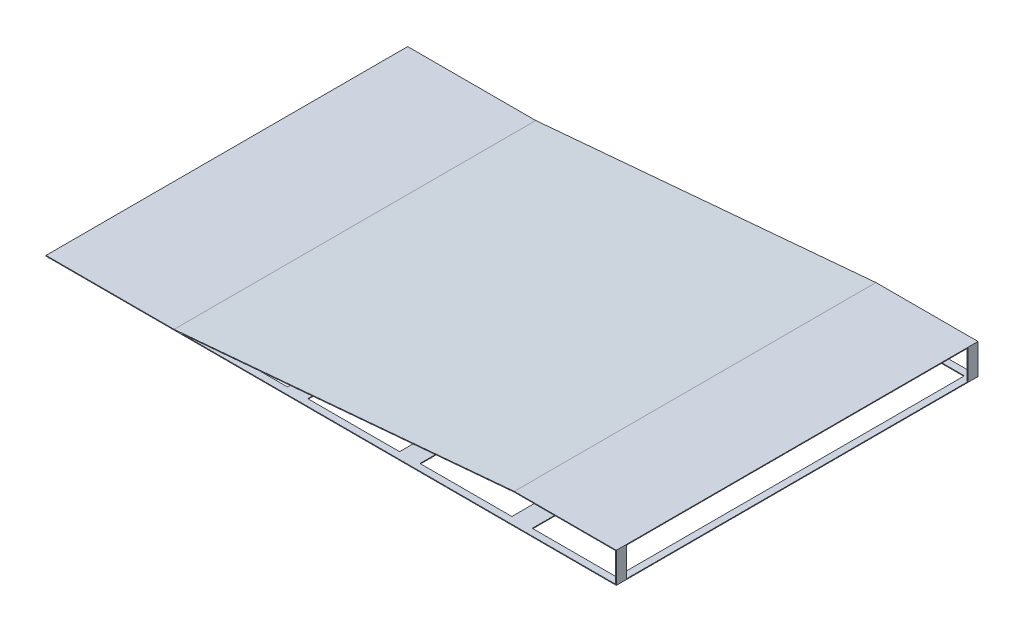
ISO-10303-21;
HEADER;
FILE_DESCRIPTION(('STEP AP214'),'2;1');
FILE_NAME('part.step','',(''),(''),'','','');
FILE_SCHEMA(('AUTOMOTIVE_DESIGN { 1 0 10303 214 1 1 1 1 }'));
ENDSEC;
DATA;
#1=APPLICATION_CONTEXT('core data for automotive mechanical design processes');
#2=APPLICATION_PROTOCOL_DEFINITION('international standard','automotive_design',2000,#1);
#3=PRODUCT_CONTEXT('',#1,'mechanical');
#4=PRODUCT('Part','Part','',(#3));
#5=PRODUCT_RELATED_PRODUCT_CATEGORY('part','',(#4));
#6=PRODUCT_DEFINITION_FORMATION('','',#4);
#7=PRODUCT_DEFINITION_CONTEXT('part definition',#1,'design');
#8=PRODUCT_DEFINITION('design','',#6,#7);
#9=PRODUCT_DEFINITION_SHAPE('','',#8);
#10=(LENGTH_UNIT() NAMED_UNIT(*) SI_UNIT(.MILLI.,.METRE.));
#11=(NAMED_UNIT(*) PLANE_ANGLE_UNIT() SI_UNIT($,.RADIAN.));
#12=(NAMED_UNIT(*) SI_UNIT($,.STERADIAN.) SOLID_ANGLE_UNIT());
#13=UNCERTAINTY_MEASURE_WITH_UNIT(LENGTH_MEASURE(1.E-05),#10,'distance_accuracy_value','');
#14=(GEOMETRIC_REPRESENTATION_CONTEXT(3) GLOBAL_UNCERTAINTY_ASSIGNED_CONTEXT((#13)) GLOBAL_UNIT_ASSIGNED_CONTEXT((#10,
#11,#12)) REPRESENTATION_CONTEXT('',''));
#15=CARTESIAN_POINT('',(0.,0.,0.));
#16=DIRECTION('',(0.,0.,1.));
#17=DIRECTION('',(1.,0.,0.));
#18=AXIS2_PLACEMENT_3D('',#15,#16,#17);
#19=CARTESIAN_POINT('',(8372.5,9.99999999999999,0.));
#20=DIRECTION('',(1.,0.,0.));
#21=DIRECTION('',(0.,0.,-1.));
#22=AXIS2_PLACEMENT_3D('',#19,#20,#21);
#23=PLANE('',#22);
#24=DIRECTION('',(0.,1.,0.));
#25=VECTOR('',#24,1.);
#26=CARTESIAN_POINT('',(8372.5,9.99999999999999,5166.));
#27=LINE('',#26,#25);
#28=CARTESIAN_POINT('',(8372.5,9.99999999999999,5166.));
#29=VERTEX_POINT('',#28);
#30=CARTESIAN_POINT('',(8372.5,437.443317629587,5166.));
#31=VERTEX_POINT('',#30);
#32=EDGE_CURVE('E11',#29,#31,#27,.T.);
#33=ORIENTED_EDGE('',*,*,#32,.F.);
#34=DIRECTION('',(0.,0.,1.));
#35=VECTOR('',#34,1.);
#36=CARTESIAN_POINT('',(8372.5,9.99999999999999,0.));
#37=LINE('',#36,#35);
#38=CARTESIAN_POINT('',(8372.5,9.99999999999999,5316.));
#39=VERTEX_POINT('',#38);
#40=EDGE_CURVE('E399',#29,#39,#37,.T.);
#41=ORIENTED_EDGE('',*,*,#40,.T.);
#42=DIRECTION('',(0.,1.,0.));
#43=VECTOR('',#42,1.);
#44=CARTESIAN_POINT('',(8372.5,9.99999999999999,5316.));
#45=LINE('',#44,#43);
#46=CARTESIAN_POINT('',(8372.5,437.443317629587,5316.));
#47=VERTEX_POINT('',#46);
#48=EDGE_CURVE('E402',#39,#47,#45,.T.);
#49=ORIENTED_EDGE('',*,*,#48,.T.);
#50=DIRECTION('',(0.,0.,1.));
#51=VECTOR('',#50,1.);
#52=CARTESIAN_POINT('',(8372.5,437.443317629587,0.));
#53=LINE('',#52,#51);
#54=EDGE_CURVE('E416',#31,#47,#53,.T.);
#55=ORIENTED_EDGE('',*,*,#54,.F.);
#56=EDGE_LOOP('',(#33,#41,#49,#55));
#57=FACE_BOUND('',#56,.T.);
#58=ADVANCED_FACE('F35',(#57),#23,.F.);
#59=CARTESIAN_POINT('',(8382.5,0.,5316.));
#60=DIRECTION('',(0.,1.,0.));
#61=DIRECTION('',(-1.,0.,0.));
#62=AXIS2_PLACEMENT_3D('',#59,#60,#61);
#63=PLANE('',#62);
#64=DIRECTION('',(0.,0.,-1.));
#65=VECTOR('',#64,1.);
#66=CARTESIAN_POINT('',(3747.23713245686,0.,3.25275132383421E-13));
#67=LINE('',#66,#65);
#68=CARTESIAN_POINT('',(3747.23713245686,0.,5216.));
#69=VERTEX_POINT('',#68);
#70=CARTESIAN_POINT('',(3747.23713245686,0.,99.9999999999999));
#71=VERTEX_POINT('',#70);
#72=EDGE_CURVE('E275',#69,#71,#67,.T.);
#73=ORIENTED_EDGE('',*,*,#72,.F.);
#74=DIRECTION('',(-1.,0.,0.));
#75=VECTOR('',#74,1.);
#76=CARTESIAN_POINT('',(0.,0.,5216.));
#77=LINE('',#76,#75);
#78=CARTESIAN_POINT('',(5097.23713245686,0.,5216.));
#79=VERTEX_POINT('',#78);
#80=EDGE_CURVE('E273',#79,#69,#77,.T.);
#81=ORIENTED_EDGE('',*,*,#80,.F.);
#82=DIRECTION('',(0.,0.,-1.));
#83=VECTOR('',#82,1.);
#84=CARTESIAN_POINT('',(5097.23713245686,0.,8.84921036188884E-13));
#85=LINE('',#84,#83);
#86=CARTESIAN_POINT('',(5097.23713245686,0.,99.9999999999996));
#87=VERTEX_POINT('',#86);
#88=EDGE_CURVE('E264',#79,#87,#85,.T.);
#89=ORIENTED_EDGE('',*,*,#88,.T.);
#90=DIRECTION('',(1.,0.,0.));
#91=VECTOR('',#90,1.);
#92=CARTESIAN_POINT('',(0.,0.,100.));
#93=LINE('',#92,#91);
#94=EDGE_CURVE('E279',#71,#87,#93,.T.);
#95=ORIENTED_EDGE('',*,*,#94,.F.);
#96=EDGE_LOOP('',(#73,#81,#89,#95));
#97=FACE_BOUND('',#96,.T.);
#98=DIRECTION('',(-1.,0.,0.));
#99=VECTOR('',#98,1.);
#100=CARTESIAN_POINT('',(0.,0.,5216.));
#101=LINE('',#100,#99);
#102=CARTESIAN_POINT('',(8282.5,0.,5216.));
#103=VERTEX_POINT('',#102);
#104=CARTESIAN_POINT('',(7047.23713245686,0.,5216.));
#105=VERTEX_POINT('',#104);
#106=EDGE_CURVE('E308',#103,#105,#101,.T.);
#107=ORIENTED_EDGE('',*,*,#106,.F.);
#108=DIRECTION('',(0.,0.,1.));
#109=VECTOR('',#108,1.);
#110=CARTESIAN_POINT('',(8282.5,0.,0.));
#111=LINE('',#110,#109);
#112=CARTESIAN_POINT('',(8282.5,0.,99.9999999999998));
#113=VERTEX_POINT('',#112);
#114=EDGE_CURVE('E306',#113,#103,#111,.T.);
#115=ORIENTED_EDGE('',*,*,#114,.F.);
#116=DIRECTION('',(1.,0.,0.));
#117=VECTOR('',#116,1.);
#118=CARTESIAN_POINT('',(0.,0.,100.));
#119=LINE('',#118,#117);
#120=CARTESIAN_POINT('',(7047.23713245686,0.,99.9999999999996));
#121=VERTEX_POINT('',#120);
#122=EDGE_CURVE('E296',#121,#113,#119,.T.);
#123=ORIENTED_EDGE('',*,*,#122,.F.);
#124=DIRECTION('',(0.,0.,-1.));
#125=VECTOR('',#124,1.);
#126=CARTESIAN_POINT('',(7047.23713245686,0.,0.));
#127=LINE('',#126,#125);
#128=EDGE_CURVE('E312',#105,#121,#127,.T.);
#129=ORIENTED_EDGE('',*,*,#128,.F.);
#130=EDGE_LOOP('',(#107,#115,#123,#129));
#131=FACE_BOUND('',#130,.T.);
#132=DIRECTION('',(0.,0.,-1.));
#133=VECTOR('',#132,1.);
#134=CARTESIAN_POINT('',(3447.23713245686,0.,5.98467871117499E-13));
#135=LINE('',#134,#133);
#136=CARTESIAN_POINT('',(3447.23713245686,0.,5216.));
#137=VERTEX_POINT('',#136);
#138=CARTESIAN_POINT('',(3447.23713245686,0.,99.9999999999999));
#139=VERTEX_POINT('',#138);
#140=EDGE_CURVE('E286',#137,#139,#135,.T.);
#141=ORIENTED_EDGE('',*,*,#140,.T.);
#142=DIRECTION('',(1.,0.,0.));
#143=VECTOR('',#142,1.);
#144=CARTESIAN_POINT('',(0.,0.,100.));
#145=LINE('',#144,#143);
#146=CARTESIAN_POINT('',(2097.23713245686,0.,99.9999999999997));
#147=VERTEX_POINT('',#146);
#148=EDGE_CURVE('E357',#147,#139,#145,.T.);
#149=ORIENTED_EDGE('',*,*,#148,.F.);
#150=DIRECTION('',(0.,0.,-1.));
#151=VECTOR('',#150,1.);
#152=CARTESIAN_POINT('',(2097.23713245686,0.,3.64097099695457E-13));
#153=LINE('',#152,#151);
#154=CARTESIAN_POINT('',(2097.23713245686,0.,5216.));
#155=VERTEX_POINT('',#154);
#156=EDGE_CURVE('E372',#155,#147,#153,.T.);
#157=ORIENTED_EDGE('',*,*,#156,.F.);
#158=DIRECTION('',(-1.,0.,0.));
#159=VECTOR('',#158,1.);
#160=CARTESIAN_POINT('',(0.,0.,5216.));
#161=LINE('',#160,#159);
#162=EDGE_CURVE('E369',#137,#155,#161,.T.);
#163=ORIENTED_EDGE('',*,*,#162,.F.);
#164=EDGE_LOOP('',(#141,#149,#157,#163));
#165=FACE_BOUND('',#164,.T.);
#166=DIRECTION('',(1.,0.,0.));
#167=VECTOR('',#166,1.);
#168=CARTESIAN_POINT('',(8382.5,0.,0.));
#169=LINE('',#168,#167);
#170=CARTESIAN_POINT('',(0.,0.,0.));
#171=VERTEX_POINT('',#170);
#172=CARTESIAN_POINT('',(8382.5,0.,0.));
#173=VERTEX_POINT('',#172);
#174=EDGE_CURVE('E437',#171,#173,#169,.T.);
#175=ORIENTED_EDGE('',*,*,#174,.T.);
#176=DIRECTION('',(0.,0.,-1.));
#177=VECTOR('',#176,1.);
#178=CARTESIAN_POINT('',(8382.5,0.,5316.));
#179=LINE('',#178,#177);
#180=CARTESIAN_POINT('',(8382.5,0.,5316.));
#181=VERTEX_POINT('',#180);
#182=EDGE_CURVE('E457',#181,#173,#179,.T.);
#183=ORIENTED_EDGE('',*,*,#182,.F.);
#184=DIRECTION('',(1.,0.,0.));
#185=VECTOR('',#184,1.);
#186=CARTESIAN_POINT('',(8382.5,0.,5316.));
#187=LINE('',#186,#185);
#188=CARTESIAN_POINT('',(0.,0.,5316.));
#189=VERTEX_POINT('',#188);
#190=EDGE_CURVE('E423',#189,#181,#187,.T.);
#191=ORIENTED_EDGE('',*,*,#190,.F.);
#192=DIRECTION('',(0.,0.,-1.));
#193=VECTOR('',#192,1.);
#194=CARTESIAN_POINT('',(0.,0.,5316.));
#195=LINE('',#194,#193);
#196=EDGE_CURVE('E460',#189,#171,#195,.T.);
#197=ORIENTED_EDGE('',*,*,#196,.T.);
#198=EDGE_LOOP('',(#175,#183,#191,#197));
#199=FACE_BOUND('',#198,.T.);
#200=DIRECTION('',(0.,0.,-1.));
#201=VECTOR('',#200,1.);
#202=CARTESIAN_POINT('',(6747.23713245686,0.,1.17137420126027E-12));
#203=LINE('',#202,#201);
#204=CARTESIAN_POINT('',(6747.23713245686,0.,5216.));
#205=VERTEX_POINT('',#204);
#206=CARTESIAN_POINT('',(6747.23713245686,0.,99.9999999999996));
#207=VERTEX_POINT('',#206);
#208=EDGE_CURVE('E257',#205,#207,#203,.T.);
#209=ORIENTED_EDGE('',*,*,#208,.T.);
#210=DIRECTION('',(1.,0.,0.));
#211=VECTOR('',#210,1.);
#212=CARTESIAN_POINT('',(0.,0.,100.));
#213=LINE('',#212,#211);
#214=CARTESIAN_POINT('',(5397.23713245686,0.,99.9999999999996));
#215=VERTEX_POINT('',#214);
#216=EDGE_CURVE('E327',#215,#207,#213,.T.);
#217=ORIENTED_EDGE('',*,*,#216,.F.);
#218=DIRECTION('',(0.,0.,-1.));
#219=VECTOR('',#218,1.);
#220=CARTESIAN_POINT('',(5397.23713245686,0.,9.37003429838227E-13));
#221=LINE('',#220,#219);
#222=CARTESIAN_POINT('',(5397.23713245686,0.,5216.));
#223=VERTEX_POINT('',#222);
#224=EDGE_CURVE('E342',#223,#215,#221,.T.);
#225=ORIENTED_EDGE('',*,*,#224,.F.);
#226=DIRECTION('',(-1.,0.,0.));
#227=VECTOR('',#226,1.);
#228=CARTESIAN_POINT('',(0.,0.,5216.));
#229=LINE('',#228,#227);
#230=EDGE_CURVE('E339',#205,#223,#229,.T.);
#231=ORIENTED_EDGE('',*,*,#230,.F.);
#232=EDGE_LOOP('',(#209,#217,#225,#231));
#233=FACE_BOUND('',#232,.T.);
#234=ADVANCED_FACE('F499',(#97,#131,#165,#199,#233),#63,.F.);
#235=CARTESIAN_POINT('',(1997.23713245686,10.0000000000067,0.));
#236=DIRECTION('',(0.,-1.,0.));
#237=DIRECTION('',(1.,0.,0.));
#238=AXIS2_PLACEMENT_3D('',#235,#236,#237);
#239=PLANE('',#238);
#240=ORIENTED_EDGE('',*,*,#40,.F.);
#241=DIRECTION('',(1.,0.,0.));
#242=VECTOR('',#241,1.);
#243=CARTESIAN_POINT('',(8282.5,9.99999999999999,5166.));
#244=LINE('',#243,#242);
#245=CARTESIAN_POINT('',(8382.5,9.99999999999999,5166.));
#246=VERTEX_POINT('',#245);
#247=EDGE_CURVE('E255',#29,#246,#244,.T.);
#248=ORIENTED_EDGE('',*,*,#247,.T.);
#249=DIRECTION('',(0.,0.,-1.));
#250=VECTOR('',#249,1.);
#251=CARTESIAN_POINT('',(8382.5,9.99999999999999,0.));
#252=LINE('',#251,#250);
#253=CARTESIAN_POINT('',(8382.5,9.99999999999999,150.));
#254=VERTEX_POINT('',#253);
#255=EDGE_CURVE('E50',#246,#254,#252,.T.);
#256=ORIENTED_EDGE('',*,*,#255,.T.);
#257=DIRECTION('',(1.,0.,0.));
#258=VECTOR('',#257,1.);
#259=CARTESIAN_POINT('',(8282.5,9.99999999999999,150.));
#260=LINE('',#259,#258);
#261=CARTESIAN_POINT('',(8372.5,9.99999999999999,150.));
#262=VERTEX_POINT('',#261);
#263=EDGE_CURVE('E240',#262,#254,#260,.T.);
#264=ORIENTED_EDGE('',*,*,#263,.F.);
#265=CARTESIAN_POINT('',(8372.5,9.99999999999999,0.));
#266=VERTEX_POINT('',#265);
#267=EDGE_CURVE('E417',#266,#262,#37,.T.);
#268=ORIENTED_EDGE('',*,*,#267,.F.);
#269=DIRECTION('',(1.,0.,0.));
#270=VECTOR('',#269,1.);
#271=CARTESIAN_POINT('',(1997.23713245686,10.0000000000067,0.));
#272=LINE('',#271,#270);
#273=CARTESIAN_POINT('',(1997.23713245686,10.0000000000067,0.));
#274=VERTEX_POINT('',#273);
#275=EDGE_CURVE('E386',#274,#266,#272,.T.);
#276=ORIENTED_EDGE('',*,*,#275,.F.);
#277=DIRECTION('',(0.,0.,1.));
#278=VECTOR('',#277,1.);
#279=CARTESIAN_POINT('',(1997.23713245686,10.0000000000067,0.));
#280=LINE('',#279,#278);
#281=CARTESIAN_POINT('',(1997.23713245686,10.0000000000067,5316.));
#282=VERTEX_POINT('',#281);
#283=EDGE_CURVE('E410',#274,#282,#280,.T.);
#284=ORIENTED_EDGE('',*,*,#283,.T.);
#285=DIRECTION('',(1.,0.,0.));
#286=VECTOR('',#285,1.);
#287=CARTESIAN_POINT('',(1997.23713245686,10.0000000000067,5316.));
#288=LINE('',#287,#286);
#289=EDGE_CURVE('E379',#282,#39,#288,.T.);
#290=ORIENTED_EDGE('',*,*,#289,.T.);
#291=EDGE_LOOP('',(#240,#248,#256,#264,#268,#276,#284,#290));
#292=FACE_BOUND('',#291,.T.);
#293=DIRECTION('',(0.,0.,1.));
#294=VECTOR('',#293,1.);
#295=CARTESIAN_POINT('',(8282.5,9.99999999999999,0.));
#296=LINE('',#295,#294);
#297=CARTESIAN_POINT('',(8282.5,9.99999999999999,99.9999999999998));
#298=VERTEX_POINT('',#297);
#299=CARTESIAN_POINT('',(8282.5,9.99999999999999,5216.));
#300=VERTEX_POINT('',#299);
#301=EDGE_CURVE('E293',#298,#300,#296,.T.);
#302=ORIENTED_EDGE('',*,*,#301,.T.);
#303=DIRECTION('',(-1.,0.,0.));
#304=VECTOR('',#303,1.);
#305=CARTESIAN_POINT('',(0.,10.,5216.));
#306=LINE('',#305,#304);
#307=CARTESIAN_POINT('',(7047.23713245686,10.0000000000014,5216.));
#308=VERTEX_POINT('',#307);
#309=EDGE_CURVE('E295',#300,#308,#306,.T.);
#310=ORIENTED_EDGE('',*,*,#309,.T.);
#311=DIRECTION('',(0.,0.,-1.));
#312=VECTOR('',#311,1.);
#313=CARTESIAN_POINT('',(7047.23713245686,9.99999999999999,0.));
#314=LINE('',#313,#312);
#315=CARTESIAN_POINT('',(7047.23713245686,9.99999999999999,99.9999999999996));
#316=VERTEX_POINT('',#315);
#317=EDGE_CURVE('E299',#308,#316,#314,.T.);
#318=ORIENTED_EDGE('',*,*,#317,.T.);
#319=DIRECTION('',(1.,0.,0.));
#320=VECTOR('',#319,1.);
#321=CARTESIAN_POINT('',(0.,10.,100.));
#322=LINE('',#321,#320);
#323=EDGE_CURVE('E302',#316,#298,#322,.T.);
#324=ORIENTED_EDGE('',*,*,#323,.T.);
#325=EDGE_LOOP('',(#302,#310,#318,#324));
#326=FACE_BOUND('',#325,.T.);
#327=DIRECTION('',(0.,0.,-1.));
#328=VECTOR('',#327,1.);
#329=CARTESIAN_POINT('',(6747.23713245686,9.99999999999999,1.17137420126027E-12));
#330=LINE('',#329,#328);
#331=CARTESIAN_POINT('',(6747.23713245686,9.99999999999999,5216.));
#332=VERTEX_POINT('',#331);
#333=CARTESIAN_POINT('',(6747.23713245686,9.99999999999999,99.9999999999996));
#334=VERTEX_POINT('',#333);
#335=EDGE_CURVE('E324',#332,#334,#330,.T.);
#336=ORIENTED_EDGE('',*,*,#335,.F.);
#337=DIRECTION('',(-1.,0.,0.));
#338=VECTOR('',#337,1.);
#339=CARTESIAN_POINT('',(0.,10.,5216.));
#340=LINE('',#339,#338);
#341=CARTESIAN_POINT('',(5397.23713245686,10.0000000000031,5216.));
#342=VERTEX_POINT('',#341);
#343=EDGE_CURVE('E326',#332,#342,#340,.T.);
#344=ORIENTED_EDGE('',*,*,#343,.T.);
#345=DIRECTION('',(0.,0.,-1.));
#346=VECTOR('',#345,1.);
#347=CARTESIAN_POINT('',(5397.23713245686,9.99999999999999,9.37003429838227E-13));
#348=LINE('',#347,#346);
#349=CARTESIAN_POINT('',(5397.23713245686,9.99999999999999,99.9999999999996));
#350=VERTEX_POINT('',#349);
#351=EDGE_CURVE('E330',#342,#350,#348,.T.);
#352=ORIENTED_EDGE('',*,*,#351,.T.);
#353=DIRECTION('',(1.,0.,0.));
#354=VECTOR('',#353,1.);
#355=CARTESIAN_POINT('',(0.,10.,100.));
#356=LINE('',#355,#354);
#357=EDGE_CURVE('E333',#350,#334,#356,.T.);
#358=ORIENTED_EDGE('',*,*,#357,.T.);
#359=EDGE_LOOP('',(#336,#344,#352,#358));
#360=FACE_BOUND('',#359,.T.);
#361=DIRECTION('',(0.,0.,-1.));
#362=VECTOR('',#361,1.);
#363=CARTESIAN_POINT('',(3447.23713245686,9.99999999999999,5.98467871117499E-13));
#364=LINE('',#363,#362);
#365=CARTESIAN_POINT('',(3447.23713245686,9.99999999999999,5216.));
#366=VERTEX_POINT('',#365);
#367=CARTESIAN_POINT('',(3447.23713245686,9.99999999999999,99.9999999999999));
#368=VERTEX_POINT('',#367);
#369=EDGE_CURVE('E354',#366,#368,#364,.T.);
#370=ORIENTED_EDGE('',*,*,#369,.F.);
#371=DIRECTION('',(-1.,0.,0.));
#372=VECTOR('',#371,1.);
#373=CARTESIAN_POINT('',(0.,10.,5216.));
#374=LINE('',#373,#372);
#375=CARTESIAN_POINT('',(2097.23713245686,10.0000000000066,5216.));
#376=VERTEX_POINT('',#375);
#377=EDGE_CURVE('E356',#366,#376,#374,.T.);
#378=ORIENTED_EDGE('',*,*,#377,.T.);
#379=DIRECTION('',(0.,0.,-1.));
#380=VECTOR('',#379,1.);
#381=CARTESIAN_POINT('',(2097.23713245686,10.,3.64097099695457E-13));
#382=LINE('',#381,#380);
#383=CARTESIAN_POINT('',(2097.23713245686,10.,99.9999999999997));
#384=VERTEX_POINT('',#383);
#385=EDGE_CURVE('E360',#376,#384,#382,.T.);
#386=ORIENTED_EDGE('',*,*,#385,.T.);
#387=DIRECTION('',(1.,0.,0.));
#388=VECTOR('',#387,1.);
#389=CARTESIAN_POINT('',(0.,10.,100.));
#390=LINE('',#389,#388);
#391=EDGE_CURVE('E363',#384,#368,#390,.T.);
#392=ORIENTED_EDGE('',*,*,#391,.T.);
#393=EDGE_LOOP('',(#370,#378,#386,#392));
#394=FACE_BOUND('',#393,.T.);
#395=DIRECTION('',(0.,0.,-1.));
#396=VECTOR('',#395,1.);
#397=CARTESIAN_POINT('',(5097.23713245686,9.99999999999999,8.84921036188884E-13));
#398=LINE('',#397,#396);
#399=CARTESIAN_POINT('',(5097.23713245686,9.99999999999999,5216.));
#400=VERTEX_POINT('',#399);
#401=CARTESIAN_POINT('',(5097.23713245686,9.99999999999999,99.9999999999996));
#402=VERTEX_POINT('',#401);
#403=EDGE_CURVE('E270',#400,#402,#398,.T.);
#404=ORIENTED_EDGE('',*,*,#403,.F.);
#405=DIRECTION('',(-1.,0.,0.));
#406=VECTOR('',#405,1.);
#407=CARTESIAN_POINT('',(0.,10.,5216.));
#408=LINE('',#407,#406);
#409=CARTESIAN_POINT('',(3747.23713245686,9.99999999999999,5216.));
#410=VERTEX_POINT('',#409);
#411=EDGE_CURVE('E260',#400,#410,#408,.T.);
#412=ORIENTED_EDGE('',*,*,#411,.T.);
#413=DIRECTION('',(0.,0.,-1.));
#414=VECTOR('',#413,1.);
#415=CARTESIAN_POINT('',(3747.23713245686,9.99999999999999,3.25275132383421E-13));
#416=LINE('',#415,#414);
#417=CARTESIAN_POINT('',(3747.23713245686,10.0000000000049,99.9999999999999));
#418=VERTEX_POINT('',#417);
#419=EDGE_CURVE('E263',#410,#418,#416,.T.);
#420=ORIENTED_EDGE('',*,*,#419,.T.);
#421=DIRECTION('',(1.,0.,0.));
#422=VECTOR('',#421,1.);
#423=CARTESIAN_POINT('',(0.,10.,100.));
#424=LINE('',#423,#422);
#425=EDGE_CURVE('E267',#418,#402,#424,.T.);
#426=ORIENTED_EDGE('',*,*,#425,.T.);
#427=EDGE_LOOP('',(#404,#412,#420,#426));
#428=FACE_BOUND('',#427,.T.);
#429=ADVANCED_FACE('F466',(#292,#326,#360,#394,#428),#239,.F.);
#430=CARTESIAN_POINT('',(0.,10.,5316.));
#431=DIRECTION('',(1.,0.,0.));
#432=DIRECTION('',(0.,1.,0.));
#433=AXIS2_PLACEMENT_3D('',#430,#431,#432);
#434=PLANE('',#433);
#435=DIRECTION('',(0.,-1.,0.));
#436=VECTOR('',#435,1.);
#437=CARTESIAN_POINT('',(0.,10.,0.));
#438=LINE('',#437,#436);
#439=CARTESIAN_POINT('',(0.,10.,0.));
#440=VERTEX_POINT('',#439);
#441=EDGE_CURVE('E412',#440,#171,#438,.T.);
#442=ORIENTED_EDGE('',*,*,#441,.T.);
#443=ORIENTED_EDGE('',*,*,#196,.F.);
#444=DIRECTION('',(0.,-1.,0.));
#445=VECTOR('',#444,1.);
#446=CARTESIAN_POINT('',(0.,10.,5316.));
#447=LINE('',#446,#445);
#448=CARTESIAN_POINT('',(0.,10.,5316.));
#449=VERTEX_POINT('',#448);
#450=EDGE_CURVE('E420',#449,#189,#447,.T.);
#451=ORIENTED_EDGE('',*,*,#450,.F.);
#452=DIRECTION('',(0.,0.,-1.));
#453=VECTOR('',#452,1.);
#454=CARTESIAN_POINT('',(0.,10.,5316.));
#455=LINE('',#454,#453);
#456=EDGE_CURVE('E434',#449,#440,#455,.T.);
#457=ORIENTED_EDGE('',*,*,#456,.T.);
#458=EDGE_LOOP('',(#442,#443,#451,#457));
#459=FACE_BOUND('',#458,.T.);
#460=ADVANCED_FACE('F37',(#459),#434,.F.);
#461=CARTESIAN_POINT('',(8382.5,0.,5316.));
#462=DIRECTION('',(-1.,0.,0.));
#463=DIRECTION('',(0.,0.,1.));
#464=AXIS2_PLACEMENT_3D('',#461,#462,#463);
#465=PLANE('',#464);
#466=DIRECTION('',(0.,1.,0.));
#467=VECTOR('',#466,1.);
#468=CARTESIAN_POINT('',(8382.5,0.,150.));
#469=LINE('',#468,#467);
#470=CARTESIAN_POINT('',(8382.5,437.443317629587,150.));
#471=VERTEX_POINT('',#470);
#472=EDGE_CURVE('E243',#254,#471,#469,.T.);
#473=ORIENTED_EDGE('',*,*,#472,.F.);
#474=ORIENTED_EDGE('',*,*,#255,.F.);
#475=DIRECTION('',(0.,1.,0.));
#476=VECTOR('',#475,1.);
#477=CARTESIAN_POINT('',(8382.5,0.,5166.));
#478=LINE('',#477,#476);
#479=CARTESIAN_POINT('',(8382.5,437.443317629587,5166.));
#480=VERTEX_POINT('',#479);
#481=EDGE_CURVE('E250',#246,#480,#478,.T.);
#482=ORIENTED_EDGE('',*,*,#481,.T.);
#483=DIRECTION('',(0.,0.,-1.));
#484=VECTOR('',#483,1.);
#485=CARTESIAN_POINT('',(8382.5,437.443317629587,0.));
#486=LINE('',#485,#484);
#487=EDGE_CURVE('E235',#480,#471,#486,.T.);
#488=ORIENTED_EDGE('',*,*,#487,.T.);
#489=EDGE_LOOP('',(#473,#474,#482,#488));
#490=FACE_BOUND('',#489,.T.);
#491=DIRECTION('',(0.,1.,0.));
#492=VECTOR('',#491,1.);
#493=CARTESIAN_POINT('',(8382.5,0.,0.));
#494=LINE('',#493,#492);
#495=CARTESIAN_POINT('',(8382.5,447.443317629587,0.));
#496=VERTEX_POINT('',#495);
#497=EDGE_CURVE('E439',#173,#496,#494,.T.);
#498=ORIENTED_EDGE('',*,*,#497,.T.);
#499=DIRECTION('',(0.,0.,-1.));
#500=VECTOR('',#499,1.);
#501=CARTESIAN_POINT('',(8382.5,447.443317629587,5316.));
#502=LINE('',#501,#500);
#503=CARTESIAN_POINT('',(8382.5,447.443317629587,5316.));
#504=VERTEX_POINT('',#503);
#505=EDGE_CURVE('E454',#504,#496,#502,.T.);
#506=ORIENTED_EDGE('',*,*,#505,.F.);
#507=DIRECTION('',(0.,1.,0.));
#508=VECTOR('',#507,1.);
#509=CARTESIAN_POINT('',(8382.5,0.,5316.));
#510=LINE('',#509,#508);
#511=EDGE_CURVE('E426',#181,#504,#510,.T.);
#512=ORIENTED_EDGE('',*,*,#511,.F.);
#513=ORIENTED_EDGE('',*,*,#182,.T.);
#514=EDGE_LOOP('',(#498,#506,#512,#513));
#515=FACE_BOUND('',#514,.T.);
#516=ADVANCED_FACE('F247',(#490,#515),#465,.F.);
#517=CARTESIAN_POINT('',(8382.5,447.443317629587,5316.));
#518=DIRECTION('',(0.,-1.,0.));
#519=DIRECTION('',(1.,0.,0.));
#520=AXIS2_PLACEMENT_3D('',#517,#518,#519);
#521=PLANE('',#520);
#522=DIRECTION('',(-1.,0.,0.));
#523=VECTOR('',#522,1.);
#524=CARTESIAN_POINT('',(8382.5,447.443317629587,0.));
#525=LINE('',#524,#523);
#526=CARTESIAN_POINT('',(6882.5,447.443317629587,0.));
#527=VERTEX_POINT('',#526);
#528=EDGE_CURVE('E441',#496,#527,#525,.T.);
#529=ORIENTED_EDGE('',*,*,#528,.T.);
#530=DIRECTION('',(0.,0.,-1.));
#531=VECTOR('',#530,1.);
#532=CARTESIAN_POINT('',(6882.5,447.443317629587,5316.));
#533=LINE('',#532,#531);
#534=CARTESIAN_POINT('',(6882.5,447.443317629587,5316.));
#535=VERTEX_POINT('',#534);
#536=EDGE_CURVE('E451',#535,#527,#533,.T.);
#537=ORIENTED_EDGE('',*,*,#536,.F.);
#538=DIRECTION('',(-1.,0.,0.));
#539=VECTOR('',#538,1.);
#540=CARTESIAN_POINT('',(8382.5,447.443317629587,5316.));
#541=LINE('',#540,#539);
#542=EDGE_CURVE('E428',#504,#535,#541,.T.);
#543=ORIENTED_EDGE('',*,*,#542,.F.);
#544=ORIENTED_EDGE('',*,*,#505,.T.);
#545=EDGE_LOOP('',(#529,#537,#543,#544));
#546=FACE_BOUND('',#545,.T.);
#547=ADVANCED_FACE('F604',(#546),#521,.F.);
#548=CARTESIAN_POINT('',(6882.5,447.443317629587,5316.));
#549=DIRECTION('',(0.0871557427476516,-0.996194698091746,0.));
#550=DIRECTION('',(0.996194698091746,0.0871557427476516,0.));
#551=AXIS2_PLACEMENT_3D('',#548,#549,#550);
#552=PLANE('',#551);
#553=DIRECTION('',(-0.996194698091746,-0.0871557427476515,0.));
#554=VECTOR('',#553,1.);
#555=CARTESIAN_POINT('',(6882.5,447.443317629587,0.));
#556=LINE('',#555,#554);
#557=CARTESIAN_POINT('',(1882.5,10.0000000000002,0.));
#558=VERTEX_POINT('',#557);
#559=EDGE_CURVE('E443',#527,#558,#556,.T.);
#560=ORIENTED_EDGE('',*,*,#559,.T.);
#561=DIRECTION('',(0.,0.,-1.));
#562=VECTOR('',#561,1.);
#563=CARTESIAN_POINT('',(1882.5,10.0000000000002,5316.));
#564=LINE('',#563,#562);
#565=CARTESIAN_POINT('',(1882.5,10.0000000000002,5316.));
#566=VERTEX_POINT('',#565);
#567=EDGE_CURVE('E448',#566,#558,#564,.T.);
#568=ORIENTED_EDGE('',*,*,#567,.F.);
#569=DIRECTION('',(-0.996194698091746,-0.0871557427476515,0.));
#570=VECTOR('',#569,1.);
#571=CARTESIAN_POINT('',(6882.5,447.443317629587,5316.));
#572=LINE('',#571,#570);
#573=EDGE_CURVE('E430',#535,#566,#572,.T.);
#574=ORIENTED_EDGE('',*,*,#573,.F.);
#575=ORIENTED_EDGE('',*,*,#536,.T.);
#576=EDGE_LOOP('',(#560,#568,#574,#575));
#577=FACE_BOUND('',#576,.T.);
#578=ADVANCED_FACE('F600',(#577),#552,.F.);
#579=CARTESIAN_POINT('',(1882.5,10.0000000000002,5316.));
#580=DIRECTION('',(0.,-1.,0.));
#581=DIRECTION('',(1.,0.,0.));
#582=AXIS2_PLACEMENT_3D('',#579,#580,#581);
#583=PLANE('',#582);
#584=DIRECTION('',(-1.,0.,0.));
#585=VECTOR('',#584,1.);
#586=CARTESIAN_POINT('',(1882.5,10.0000000000002,0.));
#587=LINE('',#586,#585);
#588=EDGE_CURVE('E424',#558,#440,#587,.T.);
#589=ORIENTED_EDGE('',*,*,#588,.T.);
#590=ORIENTED_EDGE('',*,*,#456,.F.);
#591=DIRECTION('',(-1.,0.,0.));
#592=VECTOR('',#591,1.);
#593=CARTESIAN_POINT('',(1882.5,10.0000000000002,5316.));
#594=LINE('',#593,#592);
#595=EDGE_CURVE('E432',#566,#449,#594,.T.);
#596=ORIENTED_EDGE('',*,*,#595,.F.);
#597=ORIENTED_EDGE('',*,*,#567,.T.);
#598=EDGE_LOOP('',(#589,#590,#596,#597));
#599=FACE_BOUND('',#598,.T.);
#600=ADVANCED_FACE('F595',(#599),#583,.F.);
#601=CARTESIAN_POINT('',(0.,0.,5316.));
#602=DIRECTION('',(0.,0.,-1.));
#603=DIRECTION('',(-1.,0.,0.));
#604=AXIS2_PLACEMENT_3D('',#601,#602,#603);
#605=PLANE('',#604);
#606=ORIENTED_EDGE('',*,*,#48,.F.);
#607=ORIENTED_EDGE('',*,*,#289,.F.);
#608=DIRECTION('',(-0.996194698091746,-0.0871557427476529,0.));
#609=VECTOR('',#608,1.);
#610=CARTESIAN_POINT('',(6882.93660942909,437.443317629587,5316.));
#611=LINE('',#610,#609);
#612=CARTESIAN_POINT('',(6882.93660942909,437.443317629587,5316.));
#613=VERTEX_POINT('',#612);
#614=EDGE_CURVE('E390',#613,#282,#611,.T.);
#615=ORIENTED_EDGE('',*,*,#614,.F.);
#616=DIRECTION('',(-1.,0.,0.));
#617=VECTOR('',#616,1.);
#618=CARTESIAN_POINT('',(8372.5,437.443317629587,5316.));
#619=LINE('',#618,#617);
#620=EDGE_CURVE('E405',#47,#613,#619,.T.);
#621=ORIENTED_EDGE('',*,*,#620,.F.);
#622=EDGE_LOOP('',(#606,#607,#615,#621));
#623=FACE_BOUND('',#622,.T.);
#624=ORIENTED_EDGE('',*,*,#450,.T.);
#625=ORIENTED_EDGE('',*,*,#190,.T.);
#626=ORIENTED_EDGE('',*,*,#511,.T.);
#627=ORIENTED_EDGE('',*,*,#542,.T.);
#628=ORIENTED_EDGE('',*,*,#573,.T.);
#629=ORIENTED_EDGE('',*,*,#595,.T.);
#630=EDGE_LOOP('',(#624,#625,#626,#627,#628,#629));
#631=FACE_BOUND('',#630,.T.);
#632=ADVANCED_FACE('F480',(#623,#631),#605,.F.);
#633=CARTESIAN_POINT('',(0.,0.,0.));
#634=DIRECTION('',(0.,0.,-1.));
#635=DIRECTION('',(-1.,0.,0.));
#636=AXIS2_PLACEMENT_3D('',#633,#634,#635);
#637=PLANE('',#636);
#638=ORIENTED_EDGE('',*,*,#275,.T.);
#639=DIRECTION('',(0.,1.,0.));
#640=VECTOR('',#639,1.);
#641=CARTESIAN_POINT('',(8372.5,9.99999999999999,0.));
#642=LINE('',#641,#640);
#643=CARTESIAN_POINT('',(8372.5,437.443317629587,0.));
#644=VERTEX_POINT('',#643);
#645=EDGE_CURVE('E389',#266,#644,#642,.T.);
#646=ORIENTED_EDGE('',*,*,#645,.T.);
#647=DIRECTION('',(-1.,0.,0.));
#648=VECTOR('',#647,1.);
#649=CARTESIAN_POINT('',(8372.5,437.443317629587,0.));
#650=LINE('',#649,#648);
#651=CARTESIAN_POINT('',(6882.93660942909,437.443317629587,0.));
#652=VERTEX_POINT('',#651);
#653=EDGE_CURVE('E393',#644,#652,#650,.T.);
#654=ORIENTED_EDGE('',*,*,#653,.T.);
#655=DIRECTION('',(-0.996194698091746,-0.0871557427476529,0.));
#656=VECTOR('',#655,1.);
#657=CARTESIAN_POINT('',(6882.93660942909,437.443317629587,0.));
#658=LINE('',#657,#656);
#659=EDGE_CURVE('E396',#652,#274,#658,.T.);
#660=ORIENTED_EDGE('',*,*,#659,.T.);
#661=EDGE_LOOP('',(#638,#646,#654,#660));
#662=FACE_BOUND('',#661,.T.);
#663=ORIENTED_EDGE('',*,*,#441,.F.);
#664=ORIENTED_EDGE('',*,*,#588,.F.);
#665=ORIENTED_EDGE('',*,*,#559,.F.);
#666=ORIENTED_EDGE('',*,*,#528,.F.);
#667=ORIENTED_EDGE('',*,*,#497,.F.);
#668=ORIENTED_EDGE('',*,*,#174,.F.);
#669=EDGE_LOOP('',(#663,#664,#665,#666,#667,#668));
#670=FACE_BOUND('',#669,.T.);
#671=ADVANCED_FACE('F470',(#662,#670),#637,.T.);
#672=CARTESIAN_POINT('',(6882.93660942909,437.443317629587,0.));
#673=DIRECTION('',(-0.0871557427476529,0.996194698091746,0.));
#674=DIRECTION('',(-0.996194698091746,-0.0871557427476529,0.));
#675=AXIS2_PLACEMENT_3D('',#672,#673,#674);
#676=PLANE('',#675);
#677=ORIENTED_EDGE('',*,*,#614,.T.);
#678=ORIENTED_EDGE('',*,*,#283,.F.);
#679=ORIENTED_EDGE('',*,*,#659,.F.);
#680=DIRECTION('',(0.,0.,1.));
#681=VECTOR('',#680,1.);
#682=CARTESIAN_POINT('',(6882.93660942909,437.443317629587,0.));
#683=LINE('',#682,#681);
#684=EDGE_CURVE('E413',#652,#613,#683,.T.);
#685=ORIENTED_EDGE('',*,*,#684,.T.);
#686=EDGE_LOOP('',(#677,#678,#679,#685));
#687=FACE_BOUND('',#686,.T.);
#688=ADVANCED_FACE('F474',(#687),#676,.F.);
#689=CARTESIAN_POINT('',(8372.5,437.443317629587,0.));
#690=DIRECTION('',(0.,1.,0.));
#691=DIRECTION('',(-1.,0.,0.));
#692=AXIS2_PLACEMENT_3D('',#689,#690,#691);
#693=PLANE('',#692);
#694=CARTESIAN_POINT('',(8372.5,437.443317629587,150.));
#695=VERTEX_POINT('',#694);
#696=EDGE_CURVE('E238',#644,#695,#53,.T.);
#697=ORIENTED_EDGE('',*,*,#696,.T.);
#698=DIRECTION('',(1.,0.,0.));
#699=VECTOR('',#698,1.);
#700=CARTESIAN_POINT('',(8282.5,437.443317629587,150.));
#701=LINE('',#700,#699);
#702=EDGE_CURVE('E58',#695,#471,#701,.T.);
#703=ORIENTED_EDGE('',*,*,#702,.T.);
#704=ORIENTED_EDGE('',*,*,#487,.F.);
#705=DIRECTION('',(1.,0.,0.));
#706=VECTOR('',#705,1.);
#707=CARTESIAN_POINT('',(8282.5,437.443317629587,5166.));
#708=LINE('',#707,#706);
#709=EDGE_CURVE('E239',#31,#480,#708,.T.);
#710=ORIENTED_EDGE('',*,*,#709,.F.);
#711=ORIENTED_EDGE('',*,*,#54,.T.);
#712=ORIENTED_EDGE('',*,*,#620,.T.);
#713=ORIENTED_EDGE('',*,*,#684,.F.);
#714=ORIENTED_EDGE('',*,*,#653,.F.);
#715=EDGE_LOOP('',(#697,#703,#704,#710,#711,#712,#713,#714));
#716=FACE_BOUND('',#715,.T.);
#717=ADVANCED_FACE('F232',(#716),#693,.F.);
#718=ORIENTED_EDGE('',*,*,#267,.T.);
#719=DIRECTION('',(0.,1.,0.));
#720=VECTOR('',#719,1.);
#721=CARTESIAN_POINT('',(8372.5,9.99999999999999,150.));
#722=LINE('',#721,#720);
#723=EDGE_CURVE('E43',#262,#695,#722,.T.);
#724=ORIENTED_EDGE('',*,*,#723,.T.);
#725=ORIENTED_EDGE('',*,*,#696,.F.);
#726=ORIENTED_EDGE('',*,*,#645,.F.);
#727=EDGE_LOOP('',(#718,#724,#725,#726));
#728=FACE_BOUND('',#727,.T.);
#729=ADVANCED_FACE('F463',(#728),#23,.F.);
#730=CARTESIAN_POINT('',(3447.23713245686,9.99999999999999,5.98467871117499E-13));
#731=DIRECTION('',(-1.,0.,0.));
#732=DIRECTION('',(0.,0.,1.));
#733=AXIS2_PLACEMENT_3D('',#730,#731,#732);
#734=PLANE('',#733);
#735=ORIENTED_EDGE('',*,*,#140,.F.);
#736=DIRECTION('',(0.,-1.,0.));
#737=VECTOR('',#736,1.);
#738=CARTESIAN_POINT('',(3447.23713245686,9.99999999999999,5216.));
#739=LINE('',#738,#737);
#740=EDGE_CURVE('E366',#366,#137,#739,.T.);
#741=ORIENTED_EDGE('',*,*,#740,.F.);
#742=ORIENTED_EDGE('',*,*,#369,.T.);
#743=DIRECTION('',(0.,-1.,0.));
#744=VECTOR('',#743,1.);
#745=CARTESIAN_POINT('',(3447.23713245686,9.99999999999999,99.9999999999999));
#746=LINE('',#745,#744);
#747=EDGE_CURVE('E377',#368,#139,#746,.T.);
#748=ORIENTED_EDGE('',*,*,#747,.T.);
#749=EDGE_LOOP('',(#735,#741,#742,#748));
#750=FACE_BOUND('',#749,.T.);
#751=ADVANCED_FACE('F508',(#750),#734,.T.);
#752=CARTESIAN_POINT('',(0.,10.,100.));
#753=DIRECTION('',(0.,0.,-1.));
#754=DIRECTION('',(-1.,0.,0.));
#755=AXIS2_PLACEMENT_3D('',#752,#753,#754);
#756=PLANE('',#755);
#757=ORIENTED_EDGE('',*,*,#148,.T.);
#758=ORIENTED_EDGE('',*,*,#747,.F.);
#759=ORIENTED_EDGE('',*,*,#391,.F.);
#760=DIRECTION('',(0.,-1.,0.));
#761=VECTOR('',#760,1.);
#762=CARTESIAN_POINT('',(2097.23713245686,10.,99.9999999999997));
#763=LINE('',#762,#761);
#764=EDGE_CURVE('E380',#384,#147,#763,.T.);
#765=ORIENTED_EDGE('',*,*,#764,.T.);
#766=EDGE_LOOP('',(#757,#758,#759,#765));
#767=FACE_BOUND('',#766,.T.);
#768=ADVANCED_FACE('F513',(#767),#756,.F.);
#769=CARTESIAN_POINT('',(2097.23713245686,10.,3.64097099695457E-13));
#770=DIRECTION('',(-1.,0.,0.));
#771=DIRECTION('',(0.,0.,1.));
#772=AXIS2_PLACEMENT_3D('',#769,#770,#771);
#773=PLANE('',#772);
#774=ORIENTED_EDGE('',*,*,#156,.T.);
#775=ORIENTED_EDGE('',*,*,#764,.F.);
#776=ORIENTED_EDGE('',*,*,#385,.F.);
#777=DIRECTION('',(0.,-1.,0.));
#778=VECTOR('',#777,1.);
#779=CARTESIAN_POINT('',(2097.23713245686,10.,5216.));
#780=LINE('',#779,#778);
#781=EDGE_CURVE('E382',#376,#155,#780,.T.);
#782=ORIENTED_EDGE('',*,*,#781,.T.);
#783=EDGE_LOOP('',(#774,#775,#776,#782));
#784=FACE_BOUND('',#783,.T.);
#785=ADVANCED_FACE('F525',(#784),#773,.F.);
#786=CARTESIAN_POINT('',(0.,10.,5216.));
#787=DIRECTION('',(0.,0.,1.));
#788=DIRECTION('',(1.,0.,0.));
#789=AXIS2_PLACEMENT_3D('',#786,#787,#788);
#790=PLANE('',#789);
#791=ORIENTED_EDGE('',*,*,#162,.T.);
#792=ORIENTED_EDGE('',*,*,#781,.F.);
#793=ORIENTED_EDGE('',*,*,#377,.F.);
#794=ORIENTED_EDGE('',*,*,#740,.T.);
#795=EDGE_LOOP('',(#791,#792,#793,#794));
#796=FACE_BOUND('',#795,.T.);
#797=ADVANCED_FACE('F521',(#796),#790,.F.);
#798=CARTESIAN_POINT('',(6747.23713245686,9.99999999999999,1.17137420126027E-12));
#799=DIRECTION('',(-1.,0.,0.));
#800=DIRECTION('',(0.,0.,1.));
#801=AXIS2_PLACEMENT_3D('',#798,#799,#800);
#802=PLANE('',#801);
#803=ORIENTED_EDGE('',*,*,#208,.F.);
#804=DIRECTION('',(0.,-1.,0.));
#805=VECTOR('',#804,1.);
#806=CARTESIAN_POINT('',(6747.23713245686,9.99999999999999,5216.));
#807=LINE('',#806,#805);
#808=EDGE_CURVE('E336',#332,#205,#807,.T.);
#809=ORIENTED_EDGE('',*,*,#808,.F.);
#810=ORIENTED_EDGE('',*,*,#335,.T.);
#811=DIRECTION('',(0.,-1.,0.));
#812=VECTOR('',#811,1.);
#813=CARTESIAN_POINT('',(6747.23713245686,9.99999999999999,99.9999999999996));
#814=LINE('',#813,#812);
#815=EDGE_CURVE('E309',#334,#207,#814,.T.);
#816=ORIENTED_EDGE('',*,*,#815,.T.);
#817=EDGE_LOOP('',(#803,#809,#810,#816));
#818=FACE_BOUND('',#817,.T.);
#819=ADVANCED_FACE('F524',(#818),#802,.T.);
#820=CARTESIAN_POINT('',(0.,10.,100.));
#821=DIRECTION('',(0.,0.,-1.));
#822=DIRECTION('',(-1.,0.,0.));
#823=AXIS2_PLACEMENT_3D('',#820,#821,#822);
#824=PLANE('',#823);
#825=ORIENTED_EDGE('',*,*,#216,.T.);
#826=ORIENTED_EDGE('',*,*,#815,.F.);
#827=ORIENTED_EDGE('',*,*,#357,.F.);
#828=DIRECTION('',(0.,-1.,0.));
#829=VECTOR('',#828,1.);
#830=CARTESIAN_POINT('',(5397.23713245686,9.99999999999999,99.9999999999996));
#831=LINE('',#830,#829);
#832=EDGE_CURVE('E348',#350,#215,#831,.T.);
#833=ORIENTED_EDGE('',*,*,#832,.T.);
#834=EDGE_LOOP('',(#825,#826,#827,#833));
#835=FACE_BOUND('',#834,.T.);
#836=ADVANCED_FACE('F535',(#835),#824,.F.);
#837=CARTESIAN_POINT('',(5397.23713245686,9.99999999999999,9.37003429838227E-13));
#838=DIRECTION('',(-1.,0.,0.));
#839=DIRECTION('',(0.,0.,1.));
#840=AXIS2_PLACEMENT_3D('',#837,#838,#839);
#841=PLANE('',#840);
#842=ORIENTED_EDGE('',*,*,#224,.T.);
#843=ORIENTED_EDGE('',*,*,#832,.F.);
#844=ORIENTED_EDGE('',*,*,#351,.F.);
#845=DIRECTION('',(0.,-1.,0.));
#846=VECTOR('',#845,1.);
#847=CARTESIAN_POINT('',(5397.23713245686,9.99999999999999,5216.));
#848=LINE('',#847,#846);
#849=EDGE_CURVE('E350',#342,#223,#848,.T.);
#850=ORIENTED_EDGE('',*,*,#849,.T.);
#851=EDGE_LOOP('',(#842,#843,#844,#850));
#852=FACE_BOUND('',#851,.T.);
#853=ADVANCED_FACE('F541',(#852),#841,.F.);
#854=CARTESIAN_POINT('',(0.,10.,5216.));
#855=DIRECTION('',(0.,0.,1.));
#856=DIRECTION('',(1.,0.,0.));
#857=AXIS2_PLACEMENT_3D('',#854,#855,#856);
#858=PLANE('',#857);
#859=ORIENTED_EDGE('',*,*,#230,.T.);
#860=ORIENTED_EDGE('',*,*,#849,.F.);
#861=ORIENTED_EDGE('',*,*,#343,.F.);
#862=ORIENTED_EDGE('',*,*,#808,.T.);
#863=EDGE_LOOP('',(#859,#860,#861,#862));
#864=FACE_BOUND('',#863,.T.);
#865=ADVANCED_FACE('F537',(#864),#858,.F.);
#866=CARTESIAN_POINT('',(8282.5,9.99999999999999,0.));
#867=DIRECTION('',(1.,0.,0.));
#868=DIRECTION('',(0.,1.,0.));
#869=AXIS2_PLACEMENT_3D('',#866,#867,#868);
#870=PLANE('',#869);
#871=ORIENTED_EDGE('',*,*,#114,.T.);
#872=DIRECTION('',(0.,-1.,0.));
#873=VECTOR('',#872,1.);
#874=CARTESIAN_POINT('',(8282.5,9.99999999999999,5216.));
#875=LINE('',#874,#873);
#876=EDGE_CURVE('E305',#300,#103,#875,.T.);
#877=ORIENTED_EDGE('',*,*,#876,.F.);
#878=ORIENTED_EDGE('',*,*,#301,.F.);
#879=DIRECTION('',(0.,-1.,0.));
#880=VECTOR('',#879,1.);
#881=CARTESIAN_POINT('',(8282.5,9.99999999999999,99.9999999999998));
#882=LINE('',#881,#880);
#883=EDGE_CURVE('E276',#298,#113,#882,.T.);
#884=ORIENTED_EDGE('',*,*,#883,.T.);
#885=EDGE_LOOP('',(#871,#877,#878,#884));
#886=FACE_BOUND('',#885,.T.);
#887=ADVANCED_FACE('F540',(#886),#870,.F.);
#888=CARTESIAN_POINT('',(0.,10.,100.));
#889=DIRECTION('',(0.,0.,-1.));
#890=DIRECTION('',(-1.,0.,0.));
#891=AXIS2_PLACEMENT_3D('',#888,#889,#890);
#892=PLANE('',#891);
#893=ORIENTED_EDGE('',*,*,#122,.T.);
#894=ORIENTED_EDGE('',*,*,#883,.F.);
#895=ORIENTED_EDGE('',*,*,#323,.F.);
#896=DIRECTION('',(0.,-1.,0.));
#897=VECTOR('',#896,1.);
#898=CARTESIAN_POINT('',(7047.23713245686,9.99999999999999,99.9999999999996));
#899=LINE('',#898,#897);
#900=EDGE_CURVE('E318',#316,#121,#899,.T.);
#901=ORIENTED_EDGE('',*,*,#900,.T.);
#902=EDGE_LOOP('',(#893,#894,#895,#901));
#903=FACE_BOUND('',#902,.T.);
#904=ADVANCED_FACE('F551',(#903),#892,.F.);
#905=CARTESIAN_POINT('',(7047.23713245686,9.99999999999999,0.));
#906=DIRECTION('',(-1.,0.,0.));
#907=DIRECTION('',(0.,-1.,0.));
#908=AXIS2_PLACEMENT_3D('',#905,#906,#907);
#909=PLANE('',#908);
#910=ORIENTED_EDGE('',*,*,#128,.T.);
#911=ORIENTED_EDGE('',*,*,#900,.F.);
#912=ORIENTED_EDGE('',*,*,#317,.F.);
#913=DIRECTION('',(0.,-1.,0.));
#914=VECTOR('',#913,1.);
#915=CARTESIAN_POINT('',(7047.23713245686,9.99999999999999,5216.));
#916=LINE('',#915,#914);
#917=EDGE_CURVE('E320',#308,#105,#916,.T.);
#918=ORIENTED_EDGE('',*,*,#917,.T.);
#919=EDGE_LOOP('',(#910,#911,#912,#918));
#920=FACE_BOUND('',#919,.T.);
#921=ADVANCED_FACE('F557',(#920),#909,.F.);
#922=CARTESIAN_POINT('',(0.,10.,5216.));
#923=DIRECTION('',(0.,0.,1.));
#924=DIRECTION('',(1.,0.,0.));
#925=AXIS2_PLACEMENT_3D('',#922,#923,#924);
#926=PLANE('',#925);
#927=ORIENTED_EDGE('',*,*,#106,.T.);
#928=ORIENTED_EDGE('',*,*,#917,.F.);
#929=ORIENTED_EDGE('',*,*,#309,.F.);
#930=ORIENTED_EDGE('',*,*,#876,.T.);
#931=EDGE_LOOP('',(#927,#928,#929,#930));
#932=FACE_BOUND('',#931,.T.);
#933=ADVANCED_FACE('F553',(#932),#926,.F.);
#934=CARTESIAN_POINT('',(0.,10.,5216.));
#935=DIRECTION('',(0.,0.,1.));
#936=DIRECTION('',(1.,0.,0.));
#937=AXIS2_PLACEMENT_3D('',#934,#935,#936);
#938=PLANE('',#937);
#939=ORIENTED_EDGE('',*,*,#80,.T.);
#940=DIRECTION('',(0.,-1.,0.));
#941=VECTOR('',#940,1.);
#942=CARTESIAN_POINT('',(3747.23713245686,9.99999999999999,5216.));
#943=LINE('',#942,#941);
#944=EDGE_CURVE('E272',#410,#69,#943,.T.);
#945=ORIENTED_EDGE('',*,*,#944,.F.);
#946=ORIENTED_EDGE('',*,*,#411,.F.);
#947=DIRECTION('',(0.,-1.,0.));
#948=VECTOR('',#947,1.);
#949=CARTESIAN_POINT('',(5097.23713245686,9.99999999999999,5216.));
#950=LINE('',#949,#948);
#951=EDGE_CURVE('E284',#400,#79,#950,.T.);
#952=ORIENTED_EDGE('',*,*,#951,.T.);
#953=EDGE_LOOP('',(#939,#945,#946,#952));
#954=FACE_BOUND('',#953,.T.);
#955=ADVANCED_FACE('F556',(#954),#938,.F.);
#956=CARTESIAN_POINT('',(5097.23713245686,9.99999999999999,8.84921036188884E-13));
#957=DIRECTION('',(-1.,0.,0.));
#958=DIRECTION('',(0.,0.,1.));
#959=AXIS2_PLACEMENT_3D('',#956,#957,#958);
#960=PLANE('',#959);
#961=ORIENTED_EDGE('',*,*,#88,.F.);
#962=ORIENTED_EDGE('',*,*,#951,.F.);
#963=ORIENTED_EDGE('',*,*,#403,.T.);
#964=DIRECTION('',(0.,-1.,0.));
#965=VECTOR('',#964,1.);
#966=CARTESIAN_POINT('',(5097.23713245686,9.99999999999999,99.9999999999996));
#967=LINE('',#966,#965);
#968=EDGE_CURVE('E287',#402,#87,#967,.T.);
#969=ORIENTED_EDGE('',*,*,#968,.T.);
#970=EDGE_LOOP('',(#961,#962,#963,#969));
#971=FACE_BOUND('',#970,.T.);
#972=ADVANCED_FACE('F566',(#971),#960,.T.);
#973=CARTESIAN_POINT('',(0.,10.,100.));
#974=DIRECTION('',(0.,0.,-1.));
#975=DIRECTION('',(-1.,0.,0.));
#976=AXIS2_PLACEMENT_3D('',#973,#974,#975);
#977=PLANE('',#976);
#978=ORIENTED_EDGE('',*,*,#94,.T.);
#979=ORIENTED_EDGE('',*,*,#968,.F.);
#980=ORIENTED_EDGE('',*,*,#425,.F.);
#981=DIRECTION('',(0.,-1.,0.));
#982=VECTOR('',#981,1.);
#983=CARTESIAN_POINT('',(3747.23713245686,9.99999999999999,99.9999999999999));
#984=LINE('',#983,#982);
#985=EDGE_CURVE('E289',#418,#71,#984,.T.);
#986=ORIENTED_EDGE('',*,*,#985,.T.);
#987=EDGE_LOOP('',(#978,#979,#980,#986));
#988=FACE_BOUND('',#987,.T.);
#989=ADVANCED_FACE('F495',(#988),#977,.F.);
#990=CARTESIAN_POINT('',(3747.23713245686,9.99999999999999,3.25275132383421E-13));
#991=DIRECTION('',(-1.,0.,0.));
#992=DIRECTION('',(0.,0.,1.));
#993=AXIS2_PLACEMENT_3D('',#990,#991,#992);
#994=PLANE('',#993);
#995=ORIENTED_EDGE('',*,*,#72,.T.);
#996=ORIENTED_EDGE('',*,*,#985,.F.);
#997=ORIENTED_EDGE('',*,*,#419,.F.);
#998=ORIENTED_EDGE('',*,*,#944,.T.);
#999=EDGE_LOOP('',(#995,#996,#997,#998));
#1000=FACE_BOUND('',#999,.T.);
#1001=ADVANCED_FACE('F488',(#1000),#994,.F.);
#1002=CARTESIAN_POINT('',(8282.5,0.,5166.));
#1003=DIRECTION('',(0.,0.,-1.));
#1004=DIRECTION('',(-1.,0.,0.));
#1005=AXIS2_PLACEMENT_3D('',#1002,#1003,#1004);
#1006=PLANE('',#1005);
#1007=ORIENTED_EDGE('',*,*,#32,.T.);
#1008=ORIENTED_EDGE('',*,*,#709,.T.);
#1009=ORIENTED_EDGE('',*,*,#481,.F.);
#1010=ORIENTED_EDGE('',*,*,#247,.F.);
#1011=EDGE_LOOP('',(#1007,#1008,#1009,#1010));
#1012=FACE_BOUND('',#1011,.T.);
#1013=ADVANCED_FACE('F486',(#1012),#1006,.T.);
#1014=CARTESIAN_POINT('',(8282.5,0.,150.));
#1015=DIRECTION('',(0.,0.,-1.));
#1016=DIRECTION('',(-1.,0.,0.));
#1017=AXIS2_PLACEMENT_3D('',#1014,#1015,#1016);
#1018=PLANE('',#1017);
#1019=ORIENTED_EDGE('',*,*,#263,.T.);
#1020=ORIENTED_EDGE('',*,*,#472,.T.);
#1021=ORIENTED_EDGE('',*,*,#702,.F.);
#1022=ORIENTED_EDGE('',*,*,#723,.F.);
#1023=EDGE_LOOP('',(#1019,#1020,#1021,#1022));
#1024=FACE_BOUND('',#1023,.T.);
#1025=ADVANCED_FACE('F244',(#1024),#1018,.F.);
#1026=CLOSED_SHELL('',(#58,#234,#429,#460,#516,#547,#578,#600,#632,#671,#688,#717,#729,#751,
#768,#785,#797,#819,#836,#853,#865,#887,#904,#921,#933,#955,#972,#989,#1001,#1013,#1025));
#1027=MANIFOLD_SOLID_BREP('B2',#1026);
#1028=ADVANCED_BREP_SHAPE_REPRESENTATION('',(#18,#1027),#14);
#1029=SHAPE_DEFINITION_REPRESENTATION(#9,#1028);
ENDSEC;
END-ISO-10303-21;
